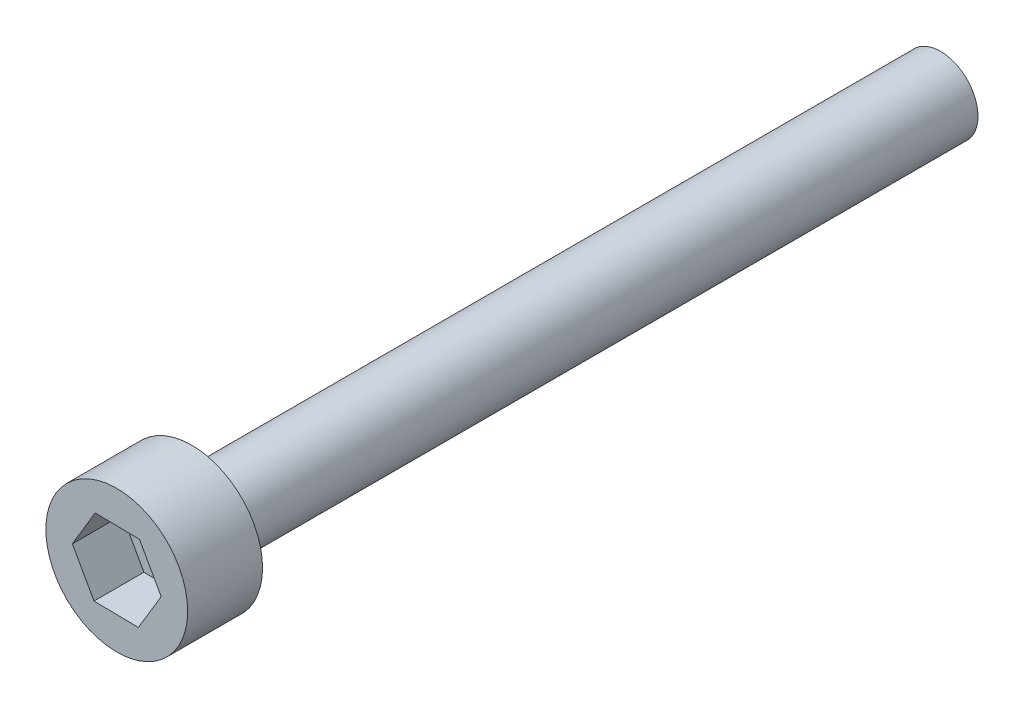
ISO-10303-21;
HEADER;
FILE_DESCRIPTION(('STEP AP214'),'2;1');
FILE_NAME('part.step','',(''),(''),'','','');
FILE_SCHEMA(('AUTOMOTIVE_DESIGN { 1 0 10303 214 1 1 1 1 }'));
ENDSEC;
DATA;
#1=APPLICATION_CONTEXT('core data for automotive mechanical design processes');
#2=APPLICATION_PROTOCOL_DEFINITION('international standard','automotive_design',2000,#1);
#3=PRODUCT_CONTEXT('',#1,'mechanical');
#4=PRODUCT('Part','Part','',(#3));
#5=PRODUCT_RELATED_PRODUCT_CATEGORY('part','',(#4));
#6=PRODUCT_DEFINITION_FORMATION('','',#4);
#7=PRODUCT_DEFINITION_CONTEXT('part definition',#1,'design');
#8=PRODUCT_DEFINITION('design','',#6,#7);
#9=PRODUCT_DEFINITION_SHAPE('','',#8);
#10=(LENGTH_UNIT() NAMED_UNIT(*) SI_UNIT(.MILLI.,.METRE.));
#11=(NAMED_UNIT(*) PLANE_ANGLE_UNIT() SI_UNIT($,.RADIAN.));
#12=(NAMED_UNIT(*) SI_UNIT($,.STERADIAN.) SOLID_ANGLE_UNIT());
#13=UNCERTAINTY_MEASURE_WITH_UNIT(LENGTH_MEASURE(1.E-05),#10,'distance_accuracy_value','');
#14=(GEOMETRIC_REPRESENTATION_CONTEXT(3) GLOBAL_UNCERTAINTY_ASSIGNED_CONTEXT((#13)) GLOBAL_UNIT_ASSIGNED_CONTEXT((#10,
#11,#12)) REPRESENTATION_CONTEXT('',''));
#15=CARTESIAN_POINT('',(0.,0.,0.));
#16=DIRECTION('',(0.,0.,1.));
#17=DIRECTION('',(1.,0.,0.));
#18=AXIS2_PLACEMENT_3D('',#15,#16,#17);
#19=CARTESIAN_POINT('',(0.,0.,3.));
#20=DIRECTION('',(0.,0.,-1.));
#21=DIRECTION('',(-1.,0.,0.));
#22=AXIS2_PLACEMENT_3D('',#19,#20,#21);
#23=CYLINDRICAL_SURFACE('',#22,2.84);
#24=CARTESIAN_POINT('',(0.,0.,3.));
#25=DIRECTION('',(0.,0.,1.));
#26=DIRECTION('',(1.,0.,0.));
#27=AXIS2_PLACEMENT_3D('',#24,#25,#26);
#28=CIRCLE('',#27,2.84);
#29=CARTESIAN_POINT('',(2.84,0.,3.));
#30=VERTEX_POINT('',#29);
#31=EDGE_CURVE('E43',#30,#30,#28,.T.);
#32=ORIENTED_EDGE('',*,*,#31,.F.);
#33=EDGE_LOOP('',(#32));
#34=FACE_BOUND('',#33,.T.);
#35=CARTESIAN_POINT('',(0.,0.,0.));
#36=DIRECTION('',(0.,0.,1.));
#37=DIRECTION('',(1.,0.,0.));
#38=AXIS2_PLACEMENT_3D('',#35,#36,#37);
#39=CIRCLE('',#38,2.84);
#40=CARTESIAN_POINT('',(2.84,0.,0.));
#41=VERTEX_POINT('',#40);
#42=EDGE_CURVE('E145',#41,#41,#39,.T.);
#43=ORIENTED_EDGE('',*,*,#42,.T.);
#44=EDGE_LOOP('',(#43));
#45=FACE_BOUND('',#44,.T.);
#46=ADVANCED_FACE('F36',(#34,#45),#23,.T.);
#47=CARTESIAN_POINT('',(0.,0.,3.));
#48=DIRECTION('',(0.,0.,1.));
#49=DIRECTION('',(1.,0.,0.));
#50=AXIS2_PLACEMENT_3D('',#47,#48,#49);
#51=PLANE('',#50);
#52=DIRECTION('',(-0.486688945822522,0.873575337343129,0.));
#53=VECTOR('',#52,1.);
#54=CARTESIAN_POINT('',(1.77803061008708,-0.027211815938925,3.));
#55=LINE('',#54,#53);
#56=CARTESIAN_POINT('',(1.77803061008708,-0.027211815938925,3.));
#57=VERTEX_POINT('',#56);
#58=CARTESIAN_POINT('',(0.912581428929756,1.52621376907229,3.));
#59=VERTEX_POINT('',#58);
#60=EDGE_CURVE('E50',#57,#59,#55,.T.);
#61=ORIENTED_EDGE('',*,*,#60,.F.);
#62=DIRECTION('',(0.513193961347449,0.858272659494937,0.));
#63=VECTOR('',#62,1.);
#64=CARTESIAN_POINT('',(0.865449181157325,-1.55342558501122,3.));
#65=LINE('',#64,#63);
#66=CARTESIAN_POINT('',(0.865449181157325,-1.55342558501122,3.));
#67=VERTEX_POINT('',#66);
#68=EDGE_CURVE('E133',#67,#57,#65,.T.);
#69=ORIENTED_EDGE('',*,*,#68,.F.);
#70=DIRECTION('',(0.999882907169972,-0.0153026778481919,0.));
#71=VECTOR('',#70,1.);
#72=CARTESIAN_POINT('',(-0.912581428929756,-1.52621376907229,3.));
#73=LINE('',#72,#71);
#74=CARTESIAN_POINT('',(-0.912581428929756,-1.52621376907229,3.));
#75=VERTEX_POINT('',#74);
#76=EDGE_CURVE('E131',#75,#67,#73,.T.);
#77=ORIENTED_EDGE('',*,*,#76,.F.);
#78=DIRECTION('',(0.486688945822522,-0.873575337343129,0.));
#79=VECTOR('',#78,1.);
#80=CARTESIAN_POINT('',(-1.77803061008708,0.0272118159389248,3.));
#81=LINE('',#80,#79);
#82=CARTESIAN_POINT('',(-1.77803061008708,0.0272118159389248,3.));
#83=VERTEX_POINT('',#82);
#84=EDGE_CURVE('E98',#83,#75,#81,.T.);
#85=ORIENTED_EDGE('',*,*,#84,.F.);
#86=DIRECTION('',(-0.513193961347449,-0.858272659494938,0.));
#87=VECTOR('',#86,1.);
#88=CARTESIAN_POINT('',(-0.865449181157325,1.55342558501122,3.));
#89=LINE('',#88,#87);
#90=CARTESIAN_POINT('',(-0.865449181157325,1.55342558501122,3.));
#91=VERTEX_POINT('',#90);
#92=EDGE_CURVE('E127',#91,#83,#89,.T.);
#93=ORIENTED_EDGE('',*,*,#92,.F.);
#94=DIRECTION('',(-0.999882907169972,0.0153026778481919,0.));
#95=VECTOR('',#94,1.);
#96=CARTESIAN_POINT('',(0.912581428929756,1.52621376907229,3.));
#97=LINE('',#96,#95);
#98=EDGE_CURVE('E124',#59,#91,#97,.T.);
#99=ORIENTED_EDGE('',*,*,#98,.F.);
#100=EDGE_LOOP('',(#61,#69,#77,#85,#93,#99));
#101=FACE_BOUND('',#100,.T.);
#102=ORIENTED_EDGE('',*,*,#31,.T.);
#103=EDGE_LOOP('',(#102));
#104=FACE_BOUND('',#103,.T.);
#105=ADVANCED_FACE('F154',(#101,#104),#51,.T.);
#106=CARTESIAN_POINT('',(0.,0.,0.));
#107=DIRECTION('',(0.,0.,1.));
#108=DIRECTION('',(1.,0.,0.));
#109=AXIS2_PLACEMENT_3D('',#106,#107,#108);
#110=PLANE('',#109);
#111=CARTESIAN_POINT('',(0.,0.,0.));
#112=DIRECTION('',(0.,0.,1.));
#113=DIRECTION('',(1.,0.,0.));
#114=AXIS2_PLACEMENT_3D('',#111,#112,#113);
#115=CIRCLE('',#114,1.5);
#116=CARTESIAN_POINT('',(1.5,0.,0.));
#117=VERTEX_POINT('',#116);
#118=EDGE_CURVE('E11',#117,#117,#115,.F.);
#119=ORIENTED_EDGE('',*,*,#118,.F.);
#120=EDGE_LOOP('',(#119));
#121=FACE_BOUND('',#120,.T.);
#122=ORIENTED_EDGE('',*,*,#42,.F.);
#123=EDGE_LOOP('',(#122));
#124=FACE_BOUND('',#123,.T.);
#125=ADVANCED_FACE('F151',(#121,#124),#110,.F.);
#126=CARTESIAN_POINT('',(0.,0.,-30.));
#127=DIRECTION('',(0.,0.,1.));
#128=DIRECTION('',(1.,0.,0.));
#129=AXIS2_PLACEMENT_3D('',#126,#127,#128);
#130=CYLINDRICAL_SURFACE('',#129,1.5);
#131=CARTESIAN_POINT('',(0.,0.,-30.));
#132=DIRECTION('',(0.,0.,-1.));
#133=DIRECTION('',(-1.,0.,0.));
#134=AXIS2_PLACEMENT_3D('',#131,#132,#133);
#135=CIRCLE('',#134,1.5);
#136=CARTESIAN_POINT('',(-1.5,0.,-30.));
#137=VERTEX_POINT('',#136);
#138=EDGE_CURVE('E137',#137,#137,#135,.T.);
#139=ORIENTED_EDGE('',*,*,#138,.F.);
#140=EDGE_LOOP('',(#139));
#141=FACE_BOUND('',#140,.T.);
#142=ORIENTED_EDGE('',*,*,#118,.T.);
#143=EDGE_LOOP('',(#142));
#144=FACE_BOUND('',#143,.T.);
#145=ADVANCED_FACE('F153',(#141,#144),#130,.T.);
#146=CARTESIAN_POINT('',(0.,0.,-30.));
#147=DIRECTION('',(0.,0.,-1.));
#148=DIRECTION('',(-1.,0.,0.));
#149=AXIS2_PLACEMENT_3D('',#146,#147,#148);
#150=PLANE('',#149);
#151=ORIENTED_EDGE('',*,*,#138,.T.);
#152=EDGE_LOOP('',(#151));
#153=FACE_BOUND('',#152,.T.);
#154=ADVANCED_FACE('F160',(#153),#150,.T.);
#155=CARTESIAN_POINT('',(1.77803061008708,-0.027211815938925,1.));
#156=DIRECTION('',(0.873575337343129,0.486688945822522,0.));
#157=DIRECTION('',(-0.486688945822522,0.873575337343129,0.));
#158=AXIS2_PLACEMENT_3D('',#155,#156,#157);
#159=PLANE('',#158);
#160=ORIENTED_EDGE('',*,*,#60,.T.);
#161=DIRECTION('',(0.,0.,1.));
#162=VECTOR('',#161,1.);
#163=CARTESIAN_POINT('',(0.912581428929756,1.52621376907229,1.));
#164=LINE('',#163,#162);
#165=CARTESIAN_POINT('',(0.912581428929756,1.52621376907229,1.));
#166=VERTEX_POINT('',#165);
#167=EDGE_CURVE('E80',#166,#59,#164,.T.);
#168=ORIENTED_EDGE('',*,*,#167,.F.);
#169=DIRECTION('',(-0.486688945822522,0.873575337343129,0.));
#170=VECTOR('',#169,1.);
#171=CARTESIAN_POINT('',(1.77803061008708,-0.027211815938925,1.));
#172=LINE('',#171,#170);
#173=CARTESIAN_POINT('',(1.77803061008708,-0.027211815938925,1.));
#174=VERTEX_POINT('',#173);
#175=EDGE_CURVE('E135',#174,#166,#172,.T.);
#176=ORIENTED_EDGE('',*,*,#175,.F.);
#177=DIRECTION('',(0.,0.,1.));
#178=VECTOR('',#177,1.);
#179=CARTESIAN_POINT('',(1.77803061008708,-0.027211815938925,1.));
#180=LINE('',#179,#178);
#181=EDGE_CURVE('E58',#174,#57,#180,.T.);
#182=ORIENTED_EDGE('',*,*,#181,.T.);
#183=EDGE_LOOP('',(#160,#168,#176,#182));
#184=FACE_BOUND('',#183,.T.);
#185=ADVANCED_FACE('F187',(#184),#159,.F.);
#186=CARTESIAN_POINT('',(0.865449181157325,-1.55342558501122,1.));
#187=DIRECTION('',(0.858272659494937,-0.513193961347449,0.));
#188=DIRECTION('',(0.513193961347449,0.858272659494937,0.));
#189=AXIS2_PLACEMENT_3D('',#186,#187,#188);
#190=PLANE('',#189);
#191=ORIENTED_EDGE('',*,*,#68,.T.);
#192=ORIENTED_EDGE('',*,*,#181,.F.);
#193=DIRECTION('',(0.513193961347449,0.858272659494937,0.));
#194=VECTOR('',#193,1.);
#195=CARTESIAN_POINT('',(0.865449181157325,-1.55342558501122,1.));
#196=LINE('',#195,#194);
#197=CARTESIAN_POINT('',(0.865449181157325,-1.55342558501122,1.));
#198=VERTEX_POINT('',#197);
#199=EDGE_CURVE('E110',#198,#174,#196,.T.);
#200=ORIENTED_EDGE('',*,*,#199,.F.);
#201=DIRECTION('',(0.,0.,1.));
#202=VECTOR('',#201,1.);
#203=CARTESIAN_POINT('',(0.865449181157325,-1.55342558501122,1.));
#204=LINE('',#203,#202);
#205=EDGE_CURVE('E102',#198,#67,#204,.T.);
#206=ORIENTED_EDGE('',*,*,#205,.T.);
#207=EDGE_LOOP('',(#191,#192,#200,#206));
#208=FACE_BOUND('',#207,.T.);
#209=ADVANCED_FACE('F192',(#208),#190,.F.);
#210=CARTESIAN_POINT('',(-0.912581428929756,-1.52621376907229,1.));
#211=DIRECTION('',(-0.0153026778481919,-0.999882907169972,0.));
#212=DIRECTION('',(0.999882907169972,-0.0153026778481919,0.));
#213=AXIS2_PLACEMENT_3D('',#210,#211,#212);
#214=PLANE('',#213);
#215=ORIENTED_EDGE('',*,*,#76,.T.);
#216=ORIENTED_EDGE('',*,*,#205,.F.);
#217=DIRECTION('',(0.999882907169972,-0.0153026778481919,0.));
#218=VECTOR('',#217,1.);
#219=CARTESIAN_POINT('',(-0.912581428929756,-1.52621376907229,1.));
#220=LINE('',#219,#218);
#221=CARTESIAN_POINT('',(-0.912581428929756,-1.52621376907229,1.));
#222=VERTEX_POINT('',#221);
#223=EDGE_CURVE('E106',#222,#198,#220,.T.);
#224=ORIENTED_EDGE('',*,*,#223,.F.);
#225=DIRECTION('',(0.,0.,1.));
#226=VECTOR('',#225,1.);
#227=CARTESIAN_POINT('',(-0.912581428929756,-1.52621376907229,1.));
#228=LINE('',#227,#226);
#229=EDGE_CURVE('E91',#222,#75,#228,.T.);
#230=ORIENTED_EDGE('',*,*,#229,.T.);
#231=EDGE_LOOP('',(#215,#216,#224,#230));
#232=FACE_BOUND('',#231,.T.);
#233=ADVANCED_FACE('F107',(#232),#214,.F.);
#234=CARTESIAN_POINT('',(-1.77803061008708,0.0272118159389248,1.));
#235=DIRECTION('',(-0.873575337343129,-0.486688945822522,0.));
#236=DIRECTION('',(0.486688945822522,-0.873575337343129,0.));
#237=AXIS2_PLACEMENT_3D('',#234,#235,#236);
#238=PLANE('',#237);
#239=ORIENTED_EDGE('',*,*,#84,.T.);
#240=ORIENTED_EDGE('',*,*,#229,.F.);
#241=DIRECTION('',(0.486688945822522,-0.873575337343129,0.));
#242=VECTOR('',#241,1.);
#243=CARTESIAN_POINT('',(-1.77803061008708,0.0272118159389248,1.));
#244=LINE('',#243,#242);
#245=CARTESIAN_POINT('',(-1.77803061008708,0.0272118159389248,1.));
#246=VERTEX_POINT('',#245);
#247=EDGE_CURVE('E95',#246,#222,#244,.T.);
#248=ORIENTED_EDGE('',*,*,#247,.F.);
#249=DIRECTION('',(0.,0.,1.));
#250=VECTOR('',#249,1.);
#251=CARTESIAN_POINT('',(-1.77803061008708,0.0272118159389248,1.));
#252=LINE('',#251,#250);
#253=EDGE_CURVE('E103',#246,#83,#252,.T.);
#254=ORIENTED_EDGE('',*,*,#253,.T.);
#255=EDGE_LOOP('',(#239,#240,#248,#254));
#256=FACE_BOUND('',#255,.T.);
#257=ADVANCED_FACE('F93',(#256),#238,.F.);
#258=CARTESIAN_POINT('',(-0.865449181157325,1.55342558501122,1.));
#259=DIRECTION('',(-0.858272659494937,0.513193961347449,0.));
#260=DIRECTION('',(-0.513193961347449,-0.858272659494938,0.));
#261=AXIS2_PLACEMENT_3D('',#258,#259,#260);
#262=PLANE('',#261);
#263=ORIENTED_EDGE('',*,*,#92,.T.);
#264=ORIENTED_EDGE('',*,*,#253,.F.);
#265=DIRECTION('',(-0.513193961347449,-0.858272659494938,0.));
#266=VECTOR('',#265,1.);
#267=CARTESIAN_POINT('',(-0.865449181157325,1.55342558501122,1.));
#268=LINE('',#267,#266);
#269=CARTESIAN_POINT('',(-0.865449181157325,1.55342558501122,1.));
#270=VERTEX_POINT('',#269);
#271=EDGE_CURVE('E116',#270,#246,#268,.T.);
#272=ORIENTED_EDGE('',*,*,#271,.F.);
#273=DIRECTION('',(0.,0.,1.));
#274=VECTOR('',#273,1.);
#275=CARTESIAN_POINT('',(-0.865449181157325,1.55342558501122,1.));
#276=LINE('',#275,#274);
#277=EDGE_CURVE('E140',#270,#91,#276,.T.);
#278=ORIENTED_EDGE('',*,*,#277,.T.);
#279=EDGE_LOOP('',(#263,#264,#272,#278));
#280=FACE_BOUND('',#279,.T.);
#281=ADVANCED_FACE('F217',(#280),#262,.F.);
#282=CARTESIAN_POINT('',(0.912581428929756,1.52621376907229,1.));
#283=DIRECTION('',(0.0153026778481919,0.999882907169972,0.));
#284=DIRECTION('',(-0.999882907169972,0.0153026778481919,0.));
#285=AXIS2_PLACEMENT_3D('',#282,#283,#284);
#286=PLANE('',#285);
#287=ORIENTED_EDGE('',*,*,#98,.T.);
#288=ORIENTED_EDGE('',*,*,#277,.F.);
#289=DIRECTION('',(-0.999882907169972,0.0153026778481919,0.));
#290=VECTOR('',#289,1.);
#291=CARTESIAN_POINT('',(0.912581428929756,1.52621376907229,1.));
#292=LINE('',#291,#290);
#293=EDGE_CURVE('E118',#166,#270,#292,.T.);
#294=ORIENTED_EDGE('',*,*,#293,.F.);
#295=ORIENTED_EDGE('',*,*,#167,.T.);
#296=EDGE_LOOP('',(#287,#288,#294,#295));
#297=FACE_BOUND('',#296,.T.);
#298=ADVANCED_FACE('F226',(#297),#286,.F.);
#299=CARTESIAN_POINT('',(0.,0.,1.));
#300=DIRECTION('',(0.,0.,1.));
#301=DIRECTION('',(1.,0.,0.));
#302=AXIS2_PLACEMENT_3D('',#299,#300,#301);
#303=PLANE('',#302);
#304=ORIENTED_EDGE('',*,*,#175,.T.);
#305=ORIENTED_EDGE('',*,*,#293,.T.);
#306=ORIENTED_EDGE('',*,*,#271,.T.);
#307=ORIENTED_EDGE('',*,*,#247,.T.);
#308=ORIENTED_EDGE('',*,*,#223,.T.);
#309=ORIENTED_EDGE('',*,*,#199,.T.);
#310=EDGE_LOOP('',(#304,#305,#306,#307,#308,#309));
#311=FACE_BOUND('',#310,.T.);
#312=ADVANCED_FACE('F113',(#311),#303,.T.);
#313=CLOSED_SHELL('',(#46,#105,#125,#145,#154,#185,#209,#233,#257,#281,#298,#312));
#314=MANIFOLD_SOLID_BREP('B2',#313);
#315=ADVANCED_BREP_SHAPE_REPRESENTATION('',(#18,#314),#14);
#316=SHAPE_DEFINITION_REPRESENTATION(#9,#315);
ENDSEC;
END-ISO-10303-21;
